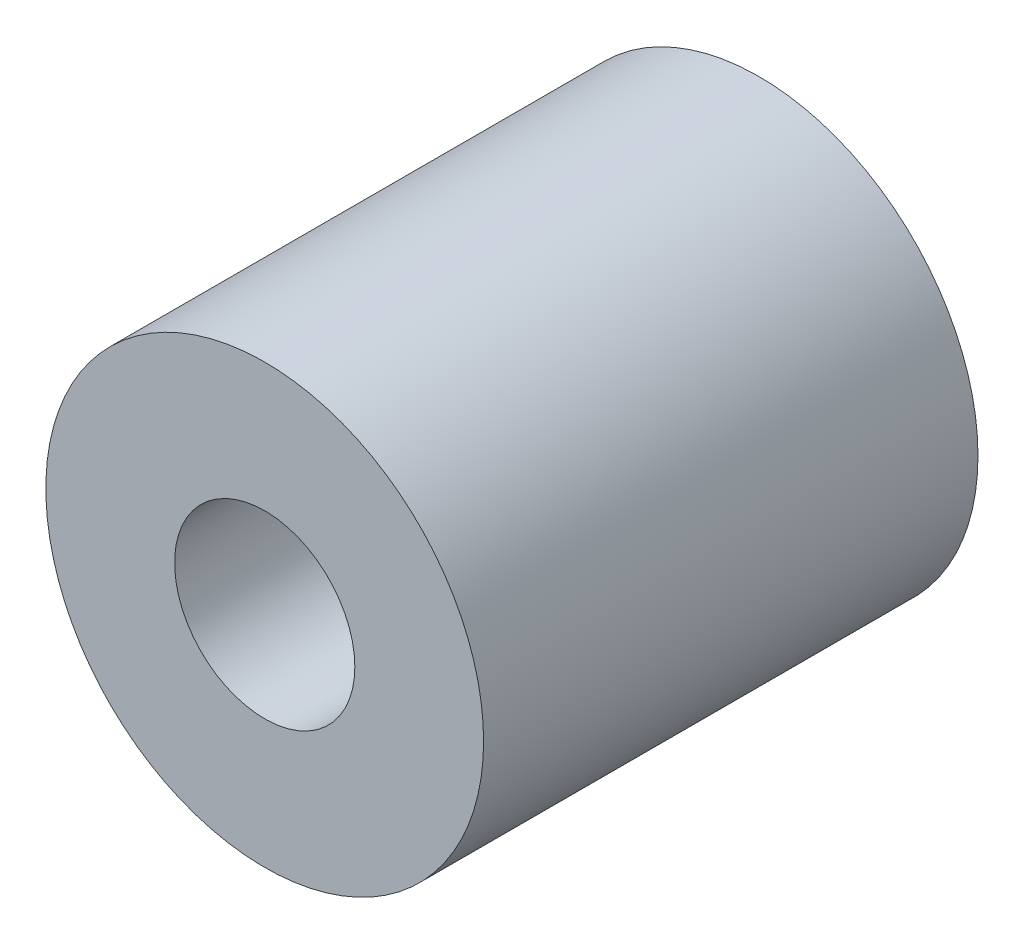
ISO-10303-21;
HEADER;
FILE_DESCRIPTION(('STEP AP214'),'2;1');
FILE_NAME('part.step','',(''),(''),'','','');
FILE_SCHEMA(('AUTOMOTIVE_DESIGN { 1 0 10303 214 1 1 1 1 }'));
ENDSEC;
DATA;
#1=APPLICATION_CONTEXT('core data for automotive mechanical design processes');
#2=APPLICATION_PROTOCOL_DEFINITION('international standard','automotive_design',2000,#1);
#3=PRODUCT_CONTEXT('',#1,'mechanical');
#4=PRODUCT('Part','Part','',(#3));
#5=PRODUCT_RELATED_PRODUCT_CATEGORY('part','',(#4));
#6=PRODUCT_DEFINITION_FORMATION('','',#4);
#7=PRODUCT_DEFINITION_CONTEXT('part definition',#1,'design');
#8=PRODUCT_DEFINITION('design','',#6,#7);
#9=PRODUCT_DEFINITION_SHAPE('','',#8);
#10=(LENGTH_UNIT() NAMED_UNIT(*) SI_UNIT(.MILLI.,.METRE.));
#11=(NAMED_UNIT(*) PLANE_ANGLE_UNIT() SI_UNIT($,.RADIAN.));
#12=(NAMED_UNIT(*) SI_UNIT($,.STERADIAN.) SOLID_ANGLE_UNIT());
#13=UNCERTAINTY_MEASURE_WITH_UNIT(LENGTH_MEASURE(1.E-05),#10,'distance_accuracy_value','');
#14=(GEOMETRIC_REPRESENTATION_CONTEXT(3) GLOBAL_UNCERTAINTY_ASSIGNED_CONTEXT((#13)) GLOBAL_UNIT_ASSIGNED_CONTEXT((#10,
#11,#12)) REPRESENTATION_CONTEXT('',''));
#15=CARTESIAN_POINT('',(0.,0.,0.));
#16=DIRECTION('',(0.,0.,1.));
#17=DIRECTION('',(1.,0.,0.));
#18=AXIS2_PLACEMENT_3D('',#15,#16,#17);
#19=CARTESIAN_POINT('',(0.,0.,17.));
#20=DIRECTION('',(0.,0.,1.));
#21=DIRECTION('',(1.,0.,0.));
#22=AXIS2_PLACEMENT_3D('',#19,#20,#21);
#23=PLANE('',#22);
#24=CARTESIAN_POINT('',(0.,0.,17.));
#25=DIRECTION('',(0.,0.,1.));
#26=DIRECTION('',(1.,0.,0.));
#27=AXIS2_PLACEMENT_3D('',#24,#25,#26);
#28=CIRCLE('',#27,3.);
#29=CARTESIAN_POINT('',(3.,0.,17.));
#30=VERTEX_POINT('',#29);
#31=EDGE_CURVE('E42',#30,#30,#28,.T.);
#32=ORIENTED_EDGE('',*,*,#31,.F.);
#33=EDGE_LOOP('',(#32));
#34=FACE_BOUND('',#33,.T.);
#35=CARTESIAN_POINT('',(0.,0.,17.));
#36=DIRECTION('',(0.,0.,1.));
#37=DIRECTION('',(1.,0.,0.));
#38=AXIS2_PLACEMENT_3D('',#35,#36,#37);
#39=CIRCLE('',#38,7.);
#40=CARTESIAN_POINT('',(7.,0.,17.));
#41=VERTEX_POINT('',#40);
#42=EDGE_CURVE('E59',#41,#41,#39,.T.);
#43=ORIENTED_EDGE('',*,*,#42,.T.);
#44=EDGE_LOOP('',(#43));
#45=FACE_BOUND('',#44,.T.);
#46=ADVANCED_FACE('F40',(#34,#45),#23,.T.);
#47=CARTESIAN_POINT('',(0.,0.,0.));
#48=DIRECTION('',(0.,0.,1.));
#49=DIRECTION('',(1.,0.,0.));
#50=AXIS2_PLACEMENT_3D('',#47,#48,#49);
#51=PLANE('',#50);
#52=CARTESIAN_POINT('',(0.,0.,0.));
#53=DIRECTION('',(0.,0.,1.));
#54=DIRECTION('',(1.,0.,0.));
#55=AXIS2_PLACEMENT_3D('',#52,#53,#54);
#56=CIRCLE('',#55,17.);
#57=CARTESIAN_POINT('',(17.,0.,0.));
#58=VERTEX_POINT('',#57);
#59=EDGE_CURVE('E10',#58,#58,#56,.T.);
#60=ORIENTED_EDGE('',*,*,#59,.F.);
#61=EDGE_LOOP('',(#60));
#62=FACE_BOUND('',#61,.T.);
#63=CARTESIAN_POINT('',(0.,0.,0.));
#64=DIRECTION('',(0.,0.,1.));
#65=DIRECTION('',(1.,0.,0.));
#66=AXIS2_PLACEMENT_3D('',#63,#64,#65);
#67=CIRCLE('',#66,3.);
#68=CARTESIAN_POINT('',(3.,0.,0.));
#69=VERTEX_POINT('',#68);
#70=EDGE_CURVE('E48',#69,#69,#67,.T.);
#71=ORIENTED_EDGE('',*,*,#70,.T.);
#72=EDGE_LOOP('',(#71));
#73=FACE_BOUND('',#72,.T.);
#74=ADVANCED_FACE('F78',(#62,#73),#51,.F.);
#75=CARTESIAN_POINT('',(0.,0.,17.));
#76=DIRECTION('',(0.,0.,-1.));
#77=DIRECTION('',(-1.,0.,0.));
#78=AXIS2_PLACEMENT_3D('',#75,#76,#77);
#79=CYLINDRICAL_SURFACE('',#78,17.);
#80=ORIENTED_EDGE('',*,*,#59,.T.);
#81=EDGE_LOOP('',(#80));
#82=FACE_BOUND('',#81,.T.);
#83=CARTESIAN_POINT('',(0.,0.,38.4));
#84=DIRECTION('',(0.,0.,1.));
#85=DIRECTION('',(1.,0.,0.));
#86=AXIS2_PLACEMENT_3D('',#83,#84,#85);
#87=CIRCLE('',#86,17.);
#88=CARTESIAN_POINT('',(17.,0.,38.4));
#89=VERTEX_POINT('',#88);
#90=EDGE_CURVE('E52',#89,#89,#87,.T.);
#91=ORIENTED_EDGE('',*,*,#90,.F.);
#92=EDGE_LOOP('',(#91));
#93=FACE_BOUND('',#92,.T.);
#94=ADVANCED_FACE('F39',(#82,#93),#79,.T.);
#95=CARTESIAN_POINT('',(0.,0.,17.));
#96=DIRECTION('',(0.,0.,-1.));
#97=DIRECTION('',(-1.,0.,0.));
#98=AXIS2_PLACEMENT_3D('',#95,#96,#97);
#99=CYLINDRICAL_SURFACE('',#98,3.);
#100=ORIENTED_EDGE('',*,*,#31,.T.);
#101=EDGE_LOOP('',(#100));
#102=FACE_BOUND('',#101,.T.);
#103=ORIENTED_EDGE('',*,*,#70,.F.);
#104=EDGE_LOOP('',(#103));
#105=FACE_BOUND('',#104,.T.);
#106=ADVANCED_FACE('F68',(#102,#105),#99,.F.);
#107=CARTESIAN_POINT('',(0.,0.,38.4));
#108=DIRECTION('',(0.,0.,1.));
#109=DIRECTION('',(1.,0.,0.));
#110=AXIS2_PLACEMENT_3D('',#107,#108,#109);
#111=PLANE('',#110);
#112=ORIENTED_EDGE('',*,*,#90,.T.);
#113=EDGE_LOOP('',(#112));
#114=FACE_BOUND('',#113,.T.);
#115=CARTESIAN_POINT('',(0.,0.,38.4));
#116=DIRECTION('',(0.,0.,1.));
#117=DIRECTION('',(1.,0.,0.));
#118=AXIS2_PLACEMENT_3D('',#115,#116,#117);
#119=CIRCLE('',#118,7.);
#120=CARTESIAN_POINT('',(7.,0.,38.4));
#121=VERTEX_POINT('',#120);
#122=EDGE_CURVE('E60',#121,#121,#119,.T.);
#123=ORIENTED_EDGE('',*,*,#122,.F.);
#124=EDGE_LOOP('',(#123));
#125=FACE_BOUND('',#124,.T.);
#126=ADVANCED_FACE('F70',(#114,#125),#111,.T.);
#127=CARTESIAN_POINT('',(0.,0.,38.4));
#128=DIRECTION('',(0.,0.,-1.));
#129=DIRECTION('',(-1.,0.,0.));
#130=AXIS2_PLACEMENT_3D('',#127,#128,#129);
#131=CYLINDRICAL_SURFACE('',#130,7.);
#132=ORIENTED_EDGE('',*,*,#122,.T.);
#133=EDGE_LOOP('',(#132));
#134=FACE_BOUND('',#133,.T.);
#135=ORIENTED_EDGE('',*,*,#42,.F.);
#136=EDGE_LOOP('',(#135));
#137=FACE_BOUND('',#136,.T.);
#138=ADVANCED_FACE('F61',(#134,#137),#131,.F.);
#139=CLOSED_SHELL('',(#46,#74,#94,#106,#126,#138));
#140=MANIFOLD_SOLID_BREP('B2',#139);
#141=ADVANCED_BREP_SHAPE_REPRESENTATION('',(#18,#140),#14);
#142=SHAPE_DEFINITION_REPRESENTATION(#9,#141);
ENDSEC;
END-ISO-10303-21;
